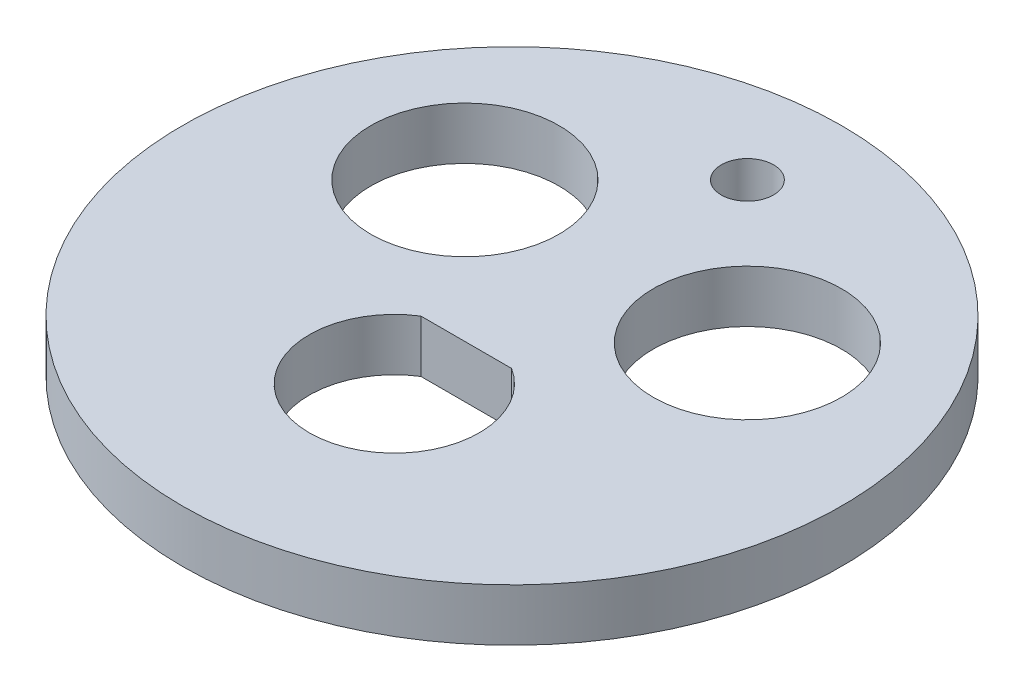
ISO-10303-21;
HEADER;
FILE_DESCRIPTION(('STEP AP214'),'2;1');
FILE_NAME('part.step','',(''),(''),'','','');
FILE_SCHEMA(('AUTOMOTIVE_DESIGN { 1 0 10303 214 1 1 1 1 }'));
ENDSEC;
DATA;
#1=APPLICATION_CONTEXT('core data for automotive mechanical design processes');
#2=APPLICATION_PROTOCOL_DEFINITION('international standard','automotive_design',2000,#1);
#3=PRODUCT_CONTEXT('',#1,'mechanical');
#4=PRODUCT('Part','Part','',(#3));
#5=PRODUCT_RELATED_PRODUCT_CATEGORY('part','',(#4));
#6=PRODUCT_DEFINITION_FORMATION('','',#4);
#7=PRODUCT_DEFINITION_CONTEXT('part definition',#1,'design');
#8=PRODUCT_DEFINITION('design','',#6,#7);
#9=PRODUCT_DEFINITION_SHAPE('','',#8);
#10=(LENGTH_UNIT() NAMED_UNIT(*) SI_UNIT(.MILLI.,.METRE.));
#11=(NAMED_UNIT(*) PLANE_ANGLE_UNIT() SI_UNIT($,.RADIAN.));
#12=(NAMED_UNIT(*) SI_UNIT($,.STERADIAN.) SOLID_ANGLE_UNIT());
#13=UNCERTAINTY_MEASURE_WITH_UNIT(LENGTH_MEASURE(1.E-05),#10,'distance_accuracy_value','');
#14=(GEOMETRIC_REPRESENTATION_CONTEXT(3) GLOBAL_UNCERTAINTY_ASSIGNED_CONTEXT((#13)) GLOBAL_UNIT_ASSIGNED_CONTEXT((#10,
#11,#12)) REPRESENTATION_CONTEXT('',''));
#15=CARTESIAN_POINT('',(0.,0.,0.));
#16=DIRECTION('',(0.,0.,1.));
#17=DIRECTION('',(1.,0.,0.));
#18=AXIS2_PLACEMENT_3D('',#15,#16,#17);
#19=CARTESIAN_POINT('',(12.6,0.,0.));
#20=DIRECTION('',(0.,-1.,0.));
#21=DIRECTION('',(0.,0.,-1.));
#22=AXIS2_PLACEMENT_3D('',#19,#20,#21);
#23=PLANE('',#22);
#24=CARTESIAN_POINT('',(-5.4,0.,-3.6));
#25=DIRECTION('',(0.,-1.,0.));
#26=DIRECTION('',(0.,0.,-1.));
#27=AXIS2_PLACEMENT_3D('',#24,#25,#26);
#28=CIRCLE('',#27,3.6);
#29=CARTESIAN_POINT('',(-5.4,0.,0.));
#30=VERTEX_POINT('',#29);
#31=EDGE_CURVE('E70',#30,#30,#28,.T.);
#32=ORIENTED_EDGE('',*,*,#31,.F.);
#33=EDGE_LOOP('',(#32));
#34=FACE_BOUND('',#33,.T.);
#35=CARTESIAN_POINT('',(5.4,0.,-3.6));
#36=DIRECTION('',(0.,-1.,0.));
#37=DIRECTION('',(0.,0.,-1.));
#38=AXIS2_PLACEMENT_3D('',#35,#36,#37);
#39=CIRCLE('',#38,3.6);
#40=CARTESIAN_POINT('',(5.4,0.,0.));
#41=VERTEX_POINT('',#40);
#42=EDGE_CURVE('E84',#41,#41,#39,.T.);
#43=ORIENTED_EDGE('',*,*,#42,.F.);
#44=EDGE_LOOP('',(#43));
#45=FACE_BOUND('',#44,.T.);
#46=CARTESIAN_POINT('',(0.,0.,-9.));
#47=DIRECTION('',(0.,-1.,0.));
#48=DIRECTION('',(0.,0.,-1.));
#49=AXIS2_PLACEMENT_3D('',#46,#47,#48);
#50=CIRCLE('',#49,1.);
#51=CARTESIAN_POINT('',(0.,0.,-8.));
#52=VERTEX_POINT('',#51);
#53=EDGE_CURVE('E75',#52,#52,#50,.T.);
#54=ORIENTED_EDGE('',*,*,#53,.F.);
#55=EDGE_LOOP('',(#54));
#56=FACE_BOUND('',#55,.T.);
#57=CARTESIAN_POINT('',(0.,0.,0.));
#58=DIRECTION('',(0.,-1.,0.));
#59=DIRECTION('',(0.,0.,-1.));
#60=AXIS2_PLACEMENT_3D('',#57,#58,#59);
#61=CIRCLE('',#60,12.6);
#62=CARTESIAN_POINT('',(0.,0.,-12.6));
#63=VERTEX_POINT('',#62);
#64=EDGE_CURVE('E46',#63,#63,#61,.T.);
#65=ORIENTED_EDGE('',*,*,#64,.T.);
#66=EDGE_LOOP('',(#65));
#67=FACE_BOUND('',#66,.T.);
#68=DIRECTION('',(1.,0.,0.));
#69=VECTOR('',#68,1.);
#70=CARTESIAN_POINT('',(12.6,0.,1.75));
#71=LINE('',#70,#69);
#72=CARTESIAN_POINT('',(1.73205080756888,0.,1.75));
#73=VERTEX_POINT('',#72);
#74=CARTESIAN_POINT('',(-1.73205080756888,0.,1.75));
#75=VERTEX_POINT('',#74);
#76=EDGE_CURVE('E63',#73,#75,#71,.F.);
#77=ORIENTED_EDGE('',*,*,#76,.T.);
#78=CARTESIAN_POINT('',(0.,0.,4.5));
#79=DIRECTION('',(0.,-1.,0.));
#80=DIRECTION('',(0.,0.,-1.));
#81=AXIS2_PLACEMENT_3D('',#78,#79,#80);
#82=CIRCLE('',#81,3.25);
#83=EDGE_CURVE('E40',#75,#73,#82,.F.);
#84=ORIENTED_EDGE('',*,*,#83,.T.);
#85=EDGE_LOOP('',(#77,#84));
#86=FACE_BOUND('',#85,.T.);
#87=ADVANCED_FACE('F37',(#34,#45,#56,#67,#86),#23,.T.);
#88=CARTESIAN_POINT('',(0.,2.,0.));
#89=DIRECTION('',(0.,1.,0.));
#90=DIRECTION('',(0.,0.,1.));
#91=AXIS2_PLACEMENT_3D('',#88,#89,#90);
#92=PLANE('',#91);
#93=CARTESIAN_POINT('',(-5.4,2.,-3.6));
#94=DIRECTION('',(0.,1.,0.));
#95=DIRECTION('',(0.,0.,1.));
#96=AXIS2_PLACEMENT_3D('',#93,#94,#95);
#97=CIRCLE('',#96,3.6);
#98=CARTESIAN_POINT('',(-5.4,2.,0.));
#99=VERTEX_POINT('',#98);
#100=EDGE_CURVE('E95',#99,#99,#97,.T.);
#101=ORIENTED_EDGE('',*,*,#100,.F.);
#102=EDGE_LOOP('',(#101));
#103=FACE_BOUND('',#102,.T.);
#104=CARTESIAN_POINT('',(5.4,2.,-3.6));
#105=DIRECTION('',(0.,1.,0.));
#106=DIRECTION('',(0.,0.,1.));
#107=AXIS2_PLACEMENT_3D('',#104,#105,#106);
#108=CIRCLE('',#107,3.6);
#109=CARTESIAN_POINT('',(5.4,2.,0.));
#110=VERTEX_POINT('',#109);
#111=EDGE_CURVE('E92',#110,#110,#108,.T.);
#112=ORIENTED_EDGE('',*,*,#111,.F.);
#113=EDGE_LOOP('',(#112));
#114=FACE_BOUND('',#113,.T.);
#115=CARTESIAN_POINT('',(0.,2.,-9.));
#116=DIRECTION('',(0.,1.,0.));
#117=DIRECTION('',(0.,0.,1.));
#118=AXIS2_PLACEMENT_3D('',#115,#116,#117);
#119=CIRCLE('',#118,1.);
#120=CARTESIAN_POINT('',(0.,2.,-8.));
#121=VERTEX_POINT('',#120);
#122=EDGE_CURVE('E89',#121,#121,#119,.T.);
#123=ORIENTED_EDGE('',*,*,#122,.F.);
#124=EDGE_LOOP('',(#123));
#125=FACE_BOUND('',#124,.T.);
#126=CARTESIAN_POINT('',(0.,2.,0.));
#127=DIRECTION('',(0.,-1.,0.));
#128=DIRECTION('',(0.,0.,-1.));
#129=AXIS2_PLACEMENT_3D('',#126,#127,#128);
#130=CIRCLE('',#129,12.6);
#131=CARTESIAN_POINT('',(0.,2.,-12.6));
#132=VERTEX_POINT('',#131);
#133=EDGE_CURVE('E11',#132,#132,#130,.T.);
#134=ORIENTED_EDGE('',*,*,#133,.F.);
#135=EDGE_LOOP('',(#134));
#136=FACE_BOUND('',#135,.T.);
#137=DIRECTION('',(-1.,0.,0.));
#138=VECTOR('',#137,1.);
#139=CARTESIAN_POINT('',(-1.73205080756888,2.,1.75));
#140=LINE('',#139,#138);
#141=CARTESIAN_POINT('',(1.73205080756888,2.,1.75));
#142=VERTEX_POINT('',#141);
#143=CARTESIAN_POINT('',(-1.73205080756888,2.,1.75));
#144=VERTEX_POINT('',#143);
#145=EDGE_CURVE('E61',#142,#144,#140,.T.);
#146=ORIENTED_EDGE('',*,*,#145,.F.);
#147=CARTESIAN_POINT('',(0.,2.,4.5));
#148=DIRECTION('',(0.,1.,0.));
#149=DIRECTION('',(0.,0.,-1.));
#150=AXIS2_PLACEMENT_3D('',#147,#148,#149);
#151=CIRCLE('',#150,3.25);
#152=EDGE_CURVE('E74',#144,#142,#151,.T.);
#153=ORIENTED_EDGE('',*,*,#152,.F.);
#154=EDGE_LOOP('',(#146,#153));
#155=FACE_BOUND('',#154,.T.);
#156=ADVANCED_FACE('F104',(#103,#114,#125,#136,#155),#92,.T.);
#157=CARTESIAN_POINT('',(0.,-200.,0.));
#158=DIRECTION('',(0.,-1.,0.));
#159=DIRECTION('',(0.,0.,-1.));
#160=AXIS2_PLACEMENT_3D('',#157,#158,#159);
#161=CYLINDRICAL_SURFACE('',#160,12.6);
#162=ORIENTED_EDGE('',*,*,#133,.T.);
#163=EDGE_LOOP('',(#162));
#164=FACE_BOUND('',#163,.T.);
#165=ORIENTED_EDGE('',*,*,#64,.F.);
#166=EDGE_LOOP('',(#165));
#167=FACE_BOUND('',#166,.T.);
#168=ADVANCED_FACE('F107',(#164,#167),#161,.T.);
#169=CARTESIAN_POINT('',(0.,-1.2E-05,-9.));
#170=DIRECTION('',(0.,1.,0.));
#171=DIRECTION('',(0.,0.,1.));
#172=AXIS2_PLACEMENT_3D('',#169,#170,#171);
#173=CYLINDRICAL_SURFACE('',#172,1.);
#174=CARTESIAN_POINT('',(0.,0.,-8.));
#175=CARTESIAN_POINT('',(0.,0.0208333333333333,-8.));
#176=CARTESIAN_POINT('',(0.,0.0416666666666667,-8.));
#177=CARTESIAN_POINT('',(0.,0.0833333333333334,-8.));
#178=CARTESIAN_POINT('',(0.,0.104166666666667,-8.));
#179=CARTESIAN_POINT('',(0.,0.145833333333333,-8.));
#180=CARTESIAN_POINT('',(0.,0.166666666666667,-8.));
#181=CARTESIAN_POINT('',(0.,0.208333333333334,-8.));
#182=CARTESIAN_POINT('',(0.,0.229166666666667,-8.));
#183=CARTESIAN_POINT('',(0.,0.270833333333334,-8.));
#184=CARTESIAN_POINT('',(0.,0.291666666666667,-8.));
#185=CARTESIAN_POINT('',(0.,0.333333333333334,-8.));
#186=CARTESIAN_POINT('',(0.,0.354166666666667,-8.));
#187=CARTESIAN_POINT('',(0.,0.395833333333334,-8.));
#188=CARTESIAN_POINT('',(0.,0.416666666666667,-8.));
#189=CARTESIAN_POINT('',(0.,0.458333333333334,-8.));
#190=CARTESIAN_POINT('',(0.,0.479166666666667,-8.));
#191=CARTESIAN_POINT('',(0.,0.520833333333334,-8.));
#192=CARTESIAN_POINT('',(0.,0.541666666666667,-8.));
#193=CARTESIAN_POINT('',(0.,0.583333333333334,-8.));
#194=CARTESIAN_POINT('',(0.,0.604166666666667,-8.));
#195=CARTESIAN_POINT('',(0.,0.645833333333334,-8.));
#196=CARTESIAN_POINT('',(0.,0.666666666666667,-8.));
#197=CARTESIAN_POINT('',(0.,0.708333333333334,-8.));
#198=CARTESIAN_POINT('',(0.,0.729166666666667,-8.));
#199=CARTESIAN_POINT('',(0.,0.770833333333334,-8.));
#200=CARTESIAN_POINT('',(0.,0.791666666666668,-8.));
#201=CARTESIAN_POINT('',(0.,0.833333333333334,-8.));
#202=CARTESIAN_POINT('',(0.,0.854166666666668,-8.));
#203=CARTESIAN_POINT('',(0.,0.895833333333334,-8.));
#204=CARTESIAN_POINT('',(0.,0.916666666666668,-8.));
#205=CARTESIAN_POINT('',(0.,0.958333333333334,-8.));
#206=CARTESIAN_POINT('',(0.,0.979166666666668,-8.));
#207=CARTESIAN_POINT('',(0.,1.02083333333333,-8.));
#208=CARTESIAN_POINT('',(0.,1.04166666666667,-8.));
#209=CARTESIAN_POINT('',(0.,1.08333333333333,-8.));
#210=CARTESIAN_POINT('',(0.,1.10416666666667,-8.));
#211=CARTESIAN_POINT('',(0.,1.14583333333333,-8.));
#212=CARTESIAN_POINT('',(0.,1.16666666666667,-8.));
#213=CARTESIAN_POINT('',(0.,1.20833333333333,-8.));
#214=CARTESIAN_POINT('',(0.,1.22916666666667,-8.));
#215=CARTESIAN_POINT('',(0.,1.27083333333333,-8.));
#216=CARTESIAN_POINT('',(0.,1.29166666666667,-8.));
#217=CARTESIAN_POINT('',(0.,1.33333333333333,-8.));
#218=CARTESIAN_POINT('',(0.,1.35416666666667,-8.));
#219=CARTESIAN_POINT('',(0.,1.39583333333333,-8.));
#220=CARTESIAN_POINT('',(0.,1.41666666666667,-8.));
#221=CARTESIAN_POINT('',(0.,1.45833333333333,-8.));
#222=CARTESIAN_POINT('',(0.,1.47916666666667,-8.));
#223=CARTESIAN_POINT('',(0.,1.52083333333334,-8.));
#224=CARTESIAN_POINT('',(0.,1.54166666666667,-8.));
#225=CARTESIAN_POINT('',(0.,1.58333333333334,-8.));
#226=CARTESIAN_POINT('',(0.,1.60416666666667,-8.));
#227=CARTESIAN_POINT('',(0.,1.64583333333334,-8.));
#228=CARTESIAN_POINT('',(0.,1.66666666666667,-8.));
#229=CARTESIAN_POINT('',(0.,1.70833333333334,-8.));
#230=CARTESIAN_POINT('',(0.,1.72916666666667,-8.));
#231=CARTESIAN_POINT('',(0.,1.77083333333334,-8.));
#232=CARTESIAN_POINT('',(0.,1.79166666666667,-8.));
#233=CARTESIAN_POINT('',(0.,1.83333333333334,-8.));
#234=CARTESIAN_POINT('',(0.,1.85416666666667,-8.));
#235=CARTESIAN_POINT('',(0.,1.89583333333334,-8.));
#236=CARTESIAN_POINT('',(0.,1.91666666666667,-8.));
#237=CARTESIAN_POINT('',(0.,1.95833333333334,-8.));
#238=CARTESIAN_POINT('',(0.,1.97916666666667,-8.));
#239=CARTESIAN_POINT('',(0.,2.,-8.));
#240=B_SPLINE_CURVE_WITH_KNOTS('',3,(#174,#175,#176,#177,#178,#179,#180,#181,#182,#183,#184,
#185,#186,#187,#188,#189,#190,#191,#192,#193,#194,#195,#196,#197,#198,#199,#200,#201,#202,#203,
#204,#205,#206,#207,#208,#209,#210,#211,#212,#213,#214,#215,#216,#217,#218,#219,#220,#221,#222,
#223,#224,#225,#226,#227,#228,#229,#230,#231,#232,#233,#234,#235,#236,#237,#238,#239),
.UNSPECIFIED.,.F.,.F.,(4,2,2,2,2,2,2,2,2,2,2,2,2,2,2,2,2,2,2,2,2,2,2,2,2,2,2,2,2,2,2,2,4),(0.,
0.0625000000000001,0.125,0.1875,0.25,0.3125,0.375,0.4375,0.5,0.5625,0.625000000000001,
0.687500000000001,0.750000000000001,0.812500000000001,0.875000000000001,0.937500000000001,1.,
1.0625,1.125,1.1875,1.25,1.3125,1.375,1.4375,1.5,1.5625,1.625,1.6875,1.75,1.8125,1.875,1.9375,
2.),.UNSPECIFIED.);
#241=EDGE_CURVE('BSEAM117',#52,#121,#240,.T.);
#242=ORIENTED_EDGE('',*,*,#53,.T.);
#243=ORIENTED_EDGE('',*,*,#122,.T.);
#244=ORIENTED_EDGE('',*,*,#241,.T.);
#245=ORIENTED_EDGE('',*,*,#241,.F.);
#246=EDGE_LOOP('',(#242,#244,#243,#245));
#247=FACE_BOUND('',#246,.T.);
#248=ADVANCED_FACE('F117',(#247),#173,.F.);
#249=CARTESIAN_POINT('',(5.4,-1.2E-05,-3.6));
#250=DIRECTION('',(0.,1.,0.));
#251=DIRECTION('',(0.,0.,1.));
#252=AXIS2_PLACEMENT_3D('',#249,#250,#251);
#253=CYLINDRICAL_SURFACE('',#252,3.6);
#254=CARTESIAN_POINT('',(5.4,0.,0.));
#255=CARTESIAN_POINT('',(5.4,0.0208333333333333,0.));
#256=CARTESIAN_POINT('',(5.4,0.0416666666666667,0.));
#257=CARTESIAN_POINT('',(5.4,0.0833333333333334,0.));
#258=CARTESIAN_POINT('',(5.4,0.104166666666667,0.));
#259=CARTESIAN_POINT('',(5.4,0.145833333333333,0.));
#260=CARTESIAN_POINT('',(5.4,0.166666666666667,0.));
#261=CARTESIAN_POINT('',(5.4,0.208333333333334,0.));
#262=CARTESIAN_POINT('',(5.4,0.229166666666667,0.));
#263=CARTESIAN_POINT('',(5.4,0.270833333333334,0.));
#264=CARTESIAN_POINT('',(5.4,0.291666666666667,0.));
#265=CARTESIAN_POINT('',(5.4,0.333333333333334,0.));
#266=CARTESIAN_POINT('',(5.4,0.354166666666667,0.));
#267=CARTESIAN_POINT('',(5.4,0.395833333333334,0.));
#268=CARTESIAN_POINT('',(5.4,0.416666666666667,0.));
#269=CARTESIAN_POINT('',(5.4,0.458333333333334,0.));
#270=CARTESIAN_POINT('',(5.4,0.479166666666667,0.));
#271=CARTESIAN_POINT('',(5.4,0.520833333333334,0.));
#272=CARTESIAN_POINT('',(5.4,0.541666666666667,0.));
#273=CARTESIAN_POINT('',(5.4,0.583333333333334,0.));
#274=CARTESIAN_POINT('',(5.4,0.604166666666667,0.));
#275=CARTESIAN_POINT('',(5.4,0.645833333333334,0.));
#276=CARTESIAN_POINT('',(5.4,0.666666666666667,0.));
#277=CARTESIAN_POINT('',(5.4,0.708333333333334,0.));
#278=CARTESIAN_POINT('',(5.4,0.729166666666667,0.));
#279=CARTESIAN_POINT('',(5.4,0.770833333333334,0.));
#280=CARTESIAN_POINT('',(5.4,0.791666666666668,0.));
#281=CARTESIAN_POINT('',(5.4,0.833333333333334,0.));
#282=CARTESIAN_POINT('',(5.4,0.854166666666668,0.));
#283=CARTESIAN_POINT('',(5.4,0.895833333333334,0.));
#284=CARTESIAN_POINT('',(5.4,0.916666666666668,0.));
#285=CARTESIAN_POINT('',(5.4,0.958333333333334,0.));
#286=CARTESIAN_POINT('',(5.4,0.979166666666668,0.));
#287=CARTESIAN_POINT('',(5.4,1.02083333333333,0.));
#288=CARTESIAN_POINT('',(5.4,1.04166666666667,0.));
#289=CARTESIAN_POINT('',(5.4,1.08333333333333,0.));
#290=CARTESIAN_POINT('',(5.4,1.10416666666667,0.));
#291=CARTESIAN_POINT('',(5.4,1.14583333333333,0.));
#292=CARTESIAN_POINT('',(5.4,1.16666666666667,0.));
#293=CARTESIAN_POINT('',(5.4,1.20833333333333,0.));
#294=CARTESIAN_POINT('',(5.4,1.22916666666667,0.));
#295=CARTESIAN_POINT('',(5.4,1.27083333333333,0.));
#296=CARTESIAN_POINT('',(5.4,1.29166666666667,0.));
#297=CARTESIAN_POINT('',(5.4,1.33333333333333,0.));
#298=CARTESIAN_POINT('',(5.4,1.35416666666667,0.));
#299=CARTESIAN_POINT('',(5.4,1.39583333333333,0.));
#300=CARTESIAN_POINT('',(5.4,1.41666666666667,0.));
#301=CARTESIAN_POINT('',(5.4,1.45833333333333,0.));
#302=CARTESIAN_POINT('',(5.4,1.47916666666667,0.));
#303=CARTESIAN_POINT('',(5.4,1.52083333333334,0.));
#304=CARTESIAN_POINT('',(5.4,1.54166666666667,0.));
#305=CARTESIAN_POINT('',(5.4,1.58333333333334,0.));
#306=CARTESIAN_POINT('',(5.4,1.60416666666667,0.));
#307=CARTESIAN_POINT('',(5.4,1.64583333333334,0.));
#308=CARTESIAN_POINT('',(5.4,1.66666666666667,0.));
#309=CARTESIAN_POINT('',(5.4,1.70833333333334,0.));
#310=CARTESIAN_POINT('',(5.4,1.72916666666667,0.));
#311=CARTESIAN_POINT('',(5.4,1.77083333333334,0.));
#312=CARTESIAN_POINT('',(5.4,1.79166666666667,0.));
#313=CARTESIAN_POINT('',(5.4,1.83333333333334,0.));
#314=CARTESIAN_POINT('',(5.4,1.85416666666667,0.));
#315=CARTESIAN_POINT('',(5.4,1.89583333333334,0.));
#316=CARTESIAN_POINT('',(5.4,1.91666666666667,0.));
#317=CARTESIAN_POINT('',(5.4,1.95833333333334,0.));
#318=CARTESIAN_POINT('',(5.4,1.97916666666667,0.));
#319=CARTESIAN_POINT('',(5.4,2.,0.));
#320=B_SPLINE_CURVE_WITH_KNOTS('',3,(#254,#255,#256,#257,#258,#259,#260,#261,#262,#263,#264,
#265,#266,#267,#268,#269,#270,#271,#272,#273,#274,#275,#276,#277,#278,#279,#280,#281,#282,#283,
#284,#285,#286,#287,#288,#289,#290,#291,#292,#293,#294,#295,#296,#297,#298,#299,#300,#301,#302,
#303,#304,#305,#306,#307,#308,#309,#310,#311,#312,#313,#314,#315,#316,#317,#318,#319),
.UNSPECIFIED.,.F.,.F.,(4,2,2,2,2,2,2,2,2,2,2,2,2,2,2,2,2,2,2,2,2,2,2,2,2,2,2,2,2,2,2,2,4),(0.,
0.0625000000000001,0.125,0.1875,0.25,0.3125,0.375,0.4375,0.5,0.5625,0.625000000000001,
0.687500000000001,0.750000000000001,0.812500000000001,0.875000000000001,0.937500000000001,1.,
1.0625,1.125,1.1875,1.25,1.3125,1.375,1.4375,1.5,1.5625,1.625,1.6875,1.75,1.8125,1.875,1.9375,
2.),.UNSPECIFIED.);
#321=EDGE_CURVE('BSEAM122',#41,#110,#320,.T.);
#322=ORIENTED_EDGE('',*,*,#42,.T.);
#323=ORIENTED_EDGE('',*,*,#111,.T.);
#324=ORIENTED_EDGE('',*,*,#321,.T.);
#325=ORIENTED_EDGE('',*,*,#321,.F.);
#326=EDGE_LOOP('',(#322,#324,#323,#325));
#327=FACE_BOUND('',#326,.T.);
#328=ADVANCED_FACE('F122',(#327),#253,.F.);
#329=CARTESIAN_POINT('',(-5.4,-1.2E-05,-3.6));
#330=DIRECTION('',(0.,1.,0.));
#331=DIRECTION('',(0.,0.,1.));
#332=AXIS2_PLACEMENT_3D('',#329,#330,#331);
#333=CYLINDRICAL_SURFACE('',#332,3.6);
#334=CARTESIAN_POINT('',(-5.4,0.,0.));
#335=CARTESIAN_POINT('',(-5.4,0.0208333333333333,0.));
#336=CARTESIAN_POINT('',(-5.4,0.0416666666666667,0.));
#337=CARTESIAN_POINT('',(-5.4,0.0833333333333334,0.));
#338=CARTESIAN_POINT('',(-5.4,0.104166666666667,0.));
#339=CARTESIAN_POINT('',(-5.4,0.145833333333333,0.));
#340=CARTESIAN_POINT('',(-5.4,0.166666666666667,0.));
#341=CARTESIAN_POINT('',(-5.4,0.208333333333334,0.));
#342=CARTESIAN_POINT('',(-5.4,0.229166666666667,0.));
#343=CARTESIAN_POINT('',(-5.4,0.270833333333334,0.));
#344=CARTESIAN_POINT('',(-5.4,0.291666666666667,0.));
#345=CARTESIAN_POINT('',(-5.4,0.333333333333334,0.));
#346=CARTESIAN_POINT('',(-5.4,0.354166666666667,0.));
#347=CARTESIAN_POINT('',(-5.4,0.395833333333334,0.));
#348=CARTESIAN_POINT('',(-5.4,0.416666666666667,0.));
#349=CARTESIAN_POINT('',(-5.4,0.458333333333334,0.));
#350=CARTESIAN_POINT('',(-5.4,0.479166666666667,0.));
#351=CARTESIAN_POINT('',(-5.4,0.520833333333334,0.));
#352=CARTESIAN_POINT('',(-5.4,0.541666666666667,0.));
#353=CARTESIAN_POINT('',(-5.4,0.583333333333334,0.));
#354=CARTESIAN_POINT('',(-5.4,0.604166666666667,0.));
#355=CARTESIAN_POINT('',(-5.4,0.645833333333334,0.));
#356=CARTESIAN_POINT('',(-5.4,0.666666666666667,0.));
#357=CARTESIAN_POINT('',(-5.4,0.708333333333334,0.));
#358=CARTESIAN_POINT('',(-5.4,0.729166666666667,0.));
#359=CARTESIAN_POINT('',(-5.4,0.770833333333334,0.));
#360=CARTESIAN_POINT('',(-5.4,0.791666666666668,0.));
#361=CARTESIAN_POINT('',(-5.4,0.833333333333334,0.));
#362=CARTESIAN_POINT('',(-5.4,0.854166666666668,0.));
#363=CARTESIAN_POINT('',(-5.4,0.895833333333334,0.));
#364=CARTESIAN_POINT('',(-5.4,0.916666666666668,0.));
#365=CARTESIAN_POINT('',(-5.4,0.958333333333334,0.));
#366=CARTESIAN_POINT('',(-5.4,0.979166666666668,0.));
#367=CARTESIAN_POINT('',(-5.4,1.02083333333333,0.));
#368=CARTESIAN_POINT('',(-5.4,1.04166666666667,0.));
#369=CARTESIAN_POINT('',(-5.4,1.08333333333333,0.));
#370=CARTESIAN_POINT('',(-5.4,1.10416666666667,0.));
#371=CARTESIAN_POINT('',(-5.4,1.14583333333333,0.));
#372=CARTESIAN_POINT('',(-5.4,1.16666666666667,0.));
#373=CARTESIAN_POINT('',(-5.4,1.20833333333333,0.));
#374=CARTESIAN_POINT('',(-5.4,1.22916666666667,0.));
#375=CARTESIAN_POINT('',(-5.4,1.27083333333333,0.));
#376=CARTESIAN_POINT('',(-5.4,1.29166666666667,0.));
#377=CARTESIAN_POINT('',(-5.4,1.33333333333333,0.));
#378=CARTESIAN_POINT('',(-5.4,1.35416666666667,0.));
#379=CARTESIAN_POINT('',(-5.4,1.39583333333333,0.));
#380=CARTESIAN_POINT('',(-5.4,1.41666666666667,0.));
#381=CARTESIAN_POINT('',(-5.4,1.45833333333333,0.));
#382=CARTESIAN_POINT('',(-5.4,1.47916666666667,0.));
#383=CARTESIAN_POINT('',(-5.4,1.52083333333334,0.));
#384=CARTESIAN_POINT('',(-5.4,1.54166666666667,0.));
#385=CARTESIAN_POINT('',(-5.4,1.58333333333334,0.));
#386=CARTESIAN_POINT('',(-5.4,1.60416666666667,0.));
#387=CARTESIAN_POINT('',(-5.4,1.64583333333334,0.));
#388=CARTESIAN_POINT('',(-5.4,1.66666666666667,0.));
#389=CARTESIAN_POINT('',(-5.4,1.70833333333334,0.));
#390=CARTESIAN_POINT('',(-5.4,1.72916666666667,0.));
#391=CARTESIAN_POINT('',(-5.4,1.77083333333334,0.));
#392=CARTESIAN_POINT('',(-5.4,1.79166666666667,0.));
#393=CARTESIAN_POINT('',(-5.4,1.83333333333334,0.));
#394=CARTESIAN_POINT('',(-5.4,1.85416666666667,0.));
#395=CARTESIAN_POINT('',(-5.4,1.89583333333334,0.));
#396=CARTESIAN_POINT('',(-5.4,1.91666666666667,0.));
#397=CARTESIAN_POINT('',(-5.4,1.95833333333334,0.));
#398=CARTESIAN_POINT('',(-5.4,1.97916666666667,0.));
#399=CARTESIAN_POINT('',(-5.4,2.,0.));
#400=B_SPLINE_CURVE_WITH_KNOTS('',3,(#334,#335,#336,#337,#338,#339,#340,#341,#342,#343,#344,
#345,#346,#347,#348,#349,#350,#351,#352,#353,#354,#355,#356,#357,#358,#359,#360,#361,#362,#363,
#364,#365,#366,#367,#368,#369,#370,#371,#372,#373,#374,#375,#376,#377,#378,#379,#380,#381,#382,
#383,#384,#385,#386,#387,#388,#389,#390,#391,#392,#393,#394,#395,#396,#397,#398,#399),
.UNSPECIFIED.,.F.,.F.,(4,2,2,2,2,2,2,2,2,2,2,2,2,2,2,2,2,2,2,2,2,2,2,2,2,2,2,2,2,2,2,2,4),(0.,
0.0625000000000001,0.125,0.1875,0.25,0.3125,0.375,0.4375,0.5,0.5625,0.625000000000001,
0.687500000000001,0.750000000000001,0.812500000000001,0.875000000000001,0.937500000000001,1.,
1.0625,1.125,1.1875,1.25,1.3125,1.375,1.4375,1.5,1.5625,1.625,1.6875,1.75,1.8125,1.875,1.9375,
2.),.UNSPECIFIED.);
#401=EDGE_CURVE('BSEAM102',#30,#99,#400,.T.);
#402=ORIENTED_EDGE('',*,*,#31,.T.);
#403=ORIENTED_EDGE('',*,*,#100,.T.);
#404=ORIENTED_EDGE('',*,*,#401,.T.);
#405=ORIENTED_EDGE('',*,*,#401,.F.);
#406=EDGE_LOOP('',(#402,#404,#403,#405));
#407=FACE_BOUND('',#406,.T.);
#408=ADVANCED_FACE('F102',(#407),#333,.F.);
#409=CARTESIAN_POINT('',(0.,2.,4.5));
#410=DIRECTION('',(0.,-1.,0.));
#411=DIRECTION('',(0.,0.,-1.));
#412=AXIS2_PLACEMENT_3D('',#409,#410,#411);
#413=CYLINDRICAL_SURFACE('',#412,3.25);
#414=DIRECTION('',(0.,-1.,0.));
#415=VECTOR('',#414,1.);
#416=CARTESIAN_POINT('',(-1.73205080756888,2.,1.75));
#417=LINE('',#416,#415);
#418=EDGE_CURVE('E54',#144,#75,#417,.T.);
#419=ORIENTED_EDGE('',*,*,#418,.F.);
#420=ORIENTED_EDGE('',*,*,#152,.T.);
#421=DIRECTION('',(0.,-1.,0.));
#422=VECTOR('',#421,1.);
#423=CARTESIAN_POINT('',(1.73205080756888,2.,1.75));
#424=LINE('',#423,#422);
#425=EDGE_CURVE('E66',#142,#73,#424,.T.);
#426=ORIENTED_EDGE('',*,*,#425,.T.);
#427=ORIENTED_EDGE('',*,*,#83,.F.);
#428=EDGE_LOOP('',(#419,#420,#426,#427));
#429=FACE_BOUND('',#428,.T.);
#430=ADVANCED_FACE('F72',(#429),#413,.F.);
#431=CARTESIAN_POINT('',(-1.73205080756888,2.,1.75));
#432=DIRECTION('',(0.,0.,1.));
#433=DIRECTION('',(1.,0.,0.));
#434=AXIS2_PLACEMENT_3D('',#431,#432,#433);
#435=PLANE('',#434);
#436=ORIENTED_EDGE('',*,*,#425,.F.);
#437=ORIENTED_EDGE('',*,*,#145,.T.);
#438=ORIENTED_EDGE('',*,*,#418,.T.);
#439=ORIENTED_EDGE('',*,*,#76,.F.);
#440=EDGE_LOOP('',(#436,#437,#438,#439));
#441=FACE_BOUND('',#440,.T.);
#442=ADVANCED_FACE('F65',(#441),#435,.T.);
#443=CLOSED_SHELL('',(#87,#156,#168,#248,#328,#408,#430,#442));
#444=MANIFOLD_SOLID_BREP('B2',#443);
#445=ADVANCED_BREP_SHAPE_REPRESENTATION('',(#18,#444),#14);
#446=SHAPE_DEFINITION_REPRESENTATION(#9,#445);
ENDSEC;
END-ISO-10303-21;
